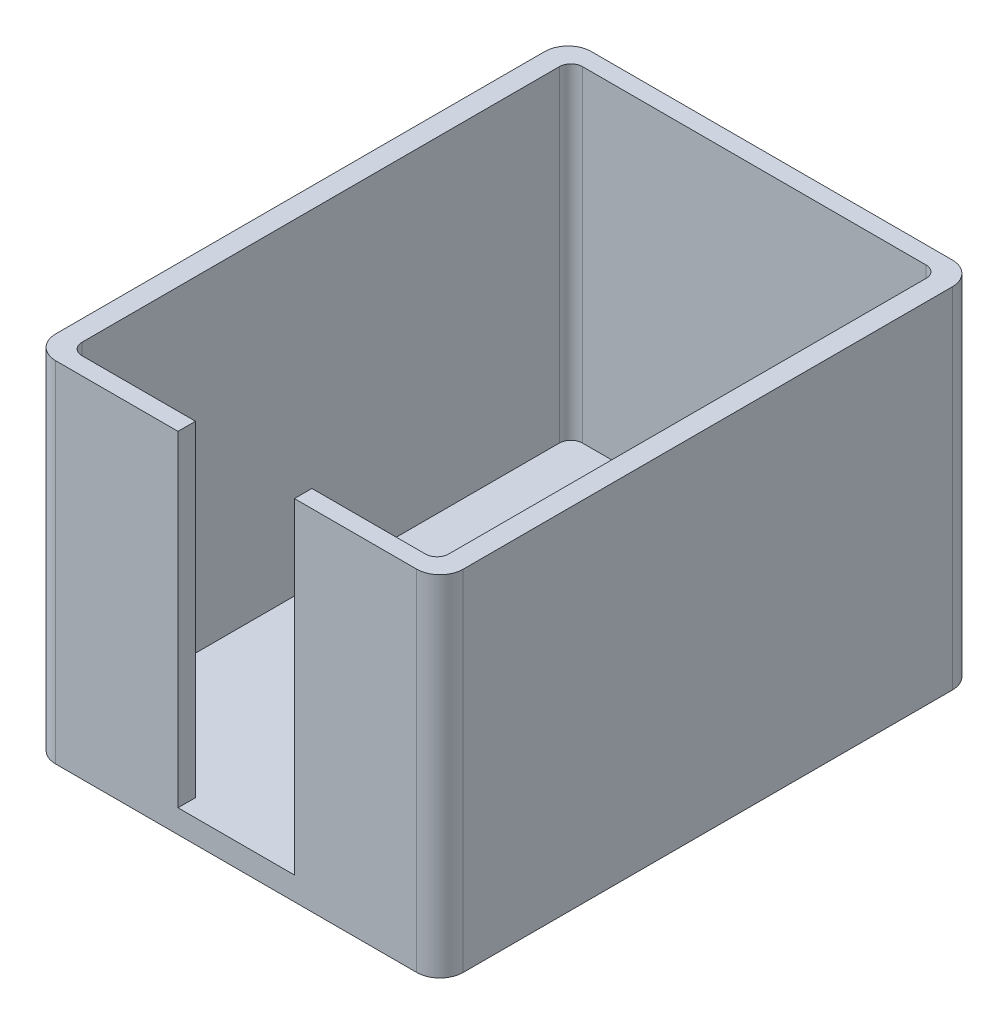
ISO-10303-21;
HEADER;
FILE_DESCRIPTION(('STEP AP214'),'2;1');
FILE_NAME('part.step','',(''),(''),'','','');
FILE_SCHEMA(('AUTOMOTIVE_DESIGN { 1 0 10303 214 1 1 1 1 }'));
ENDSEC;
DATA;
#1=APPLICATION_CONTEXT('core data for automotive mechanical design processes');
#2=APPLICATION_PROTOCOL_DEFINITION('international standard','automotive_design',2000,#1);
#3=PRODUCT_CONTEXT('',#1,'mechanical');
#4=PRODUCT('Part','Part','',(#3));
#5=PRODUCT_RELATED_PRODUCT_CATEGORY('part','',(#4));
#6=PRODUCT_DEFINITION_FORMATION('','',#4);
#7=PRODUCT_DEFINITION_CONTEXT('part definition',#1,'design');
#8=PRODUCT_DEFINITION('design','',#6,#7);
#9=PRODUCT_DEFINITION_SHAPE('','',#8);
#10=(LENGTH_UNIT() NAMED_UNIT(*) SI_UNIT(.MILLI.,.METRE.));
#11=(NAMED_UNIT(*) PLANE_ANGLE_UNIT() SI_UNIT($,.RADIAN.));
#12=(NAMED_UNIT(*) SI_UNIT($,.STERADIAN.) SOLID_ANGLE_UNIT());
#13=UNCERTAINTY_MEASURE_WITH_UNIT(LENGTH_MEASURE(1.E-05),#10,'distance_accuracy_value','');
#14=(GEOMETRIC_REPRESENTATION_CONTEXT(3) GLOBAL_UNCERTAINTY_ASSIGNED_CONTEXT((#13)) GLOBAL_UNIT_ASSIGNED_CONTEXT((#10,
#11,#12)) REPRESENTATION_CONTEXT('',''));
#15=CARTESIAN_POINT('',(0.,0.,0.));
#16=DIRECTION('',(0.,0.,1.));
#17=DIRECTION('',(1.,0.,0.));
#18=AXIS2_PLACEMENT_3D('',#15,#16,#17);
#19=CARTESIAN_POINT('',(-15.75,2.,21.5));
#20=DIRECTION('',(0.,0.,1.));
#21=DIRECTION('',(1.,0.,0.));
#22=AXIS2_PLACEMENT_3D('',#19,#20,#21);
#23=PLANE('',#22);
#24=DIRECTION('',(1.,0.,0.));
#25=VECTOR('',#24,1.);
#26=CARTESIAN_POINT('',(-15.75,2.,21.5));
#27=LINE('',#26,#25);
#28=CARTESIAN_POINT('',(5.,2.,21.5));
#29=VERTEX_POINT('',#28);
#30=CARTESIAN_POINT('',(14.75,2.,21.5));
#31=VERTEX_POINT('',#30);
#32=EDGE_CURVE('E292',#29,#31,#27,.T.);
#33=ORIENTED_EDGE('',*,*,#32,.F.);
#34=DIRECTION('',(0.,1.,0.));
#35=VECTOR('',#34,1.);
#36=CARTESIAN_POINT('',(5.,2.,21.5));
#37=LINE('',#36,#35);
#38=CARTESIAN_POINT('',(5.,30.,21.5));
#39=VERTEX_POINT('',#38);
#40=EDGE_CURVE('E293',#29,#39,#37,.T.);
#41=ORIENTED_EDGE('',*,*,#40,.T.);
#42=DIRECTION('',(1.,0.,0.));
#43=VECTOR('',#42,1.);
#44=CARTESIAN_POINT('',(-15.75,30.,21.5));
#45=LINE('',#44,#43);
#46=CARTESIAN_POINT('',(14.75,30.,21.5));
#47=VERTEX_POINT('',#46);
#48=EDGE_CURVE('E186',#39,#47,#45,.T.);
#49=ORIENTED_EDGE('',*,*,#48,.T.);
#50=DIRECTION('',(0.,1.,0.));
#51=VECTOR('',#50,1.);
#52=CARTESIAN_POINT('',(14.75,2.,21.5));
#53=LINE('',#52,#51);
#54=EDGE_CURVE('E270',#47,#31,#53,.F.);
#55=ORIENTED_EDGE('',*,*,#54,.T.);
#56=EDGE_LOOP('',(#33,#41,#49,#55));
#57=FACE_BOUND('',#56,.T.);
#58=ADVANCED_FACE('F33',(#57),#23,.F.);
#59=CARTESIAN_POINT('',(17.5,30.,-23.));
#60=DIRECTION('',(-1.,0.,0.));
#61=DIRECTION('',(0.,0.,1.));
#62=AXIS2_PLACEMENT_3D('',#59,#60,#61);
#63=PLANE('',#62);
#64=DIRECTION('',(0.,0.,-1.));
#65=VECTOR('',#64,1.);
#66=CARTESIAN_POINT('',(17.5,0.,-23.));
#67=LINE('',#66,#65);
#68=CARTESIAN_POINT('',(17.5,0.,21.));
#69=VERTEX_POINT('',#68);
#70=CARTESIAN_POINT('',(17.5,0.,-21.));
#71=VERTEX_POINT('',#70);
#72=EDGE_CURVE('E205',#69,#71,#67,.T.);
#73=ORIENTED_EDGE('',*,*,#72,.T.);
#74=DIRECTION('',(0.,-1.,0.));
#75=VECTOR('',#74,1.);
#76=CARTESIAN_POINT('',(17.5,30.,-21.));
#77=LINE('',#76,#75);
#78=CARTESIAN_POINT('',(17.5,30.,-21.));
#79=VERTEX_POINT('',#78);
#80=EDGE_CURVE('E246',#71,#79,#77,.F.);
#81=ORIENTED_EDGE('',*,*,#80,.T.);
#82=DIRECTION('',(0.,0.,-1.));
#83=VECTOR('',#82,1.);
#84=CARTESIAN_POINT('',(17.5,30.,-23.));
#85=LINE('',#84,#83);
#86=CARTESIAN_POINT('',(17.5,30.,21.));
#87=VERTEX_POINT('',#86);
#88=EDGE_CURVE('E217',#87,#79,#85,.T.);
#89=ORIENTED_EDGE('',*,*,#88,.F.);
#90=DIRECTION('',(0.,-1.,0.));
#91=VECTOR('',#90,1.);
#92=CARTESIAN_POINT('',(17.5,30.,21.));
#93=LINE('',#92,#91);
#94=EDGE_CURVE('E243',#87,#69,#93,.T.);
#95=ORIENTED_EDGE('',*,*,#94,.T.);
#96=EDGE_LOOP('',(#73,#81,#89,#95));
#97=FACE_BOUND('',#96,.T.);
#98=ADVANCED_FACE('F393',(#97),#63,.F.);
#99=CARTESIAN_POINT('',(-17.5,30.,-23.));
#100=DIRECTION('',(0.,0.,1.));
#101=DIRECTION('',(1.,0.,0.));
#102=AXIS2_PLACEMENT_3D('',#99,#100,#101);
#103=PLANE('',#102);
#104=DIRECTION('',(-1.,0.,0.));
#105=VECTOR('',#104,1.);
#106=CARTESIAN_POINT('',(-17.5,0.,-23.));
#107=LINE('',#106,#105);
#108=CARTESIAN_POINT('',(15.5,0.,-23.));
#109=VERTEX_POINT('',#108);
#110=CARTESIAN_POINT('',(-15.5,0.,-23.));
#111=VERTEX_POINT('',#110);
#112=EDGE_CURVE('E208',#109,#111,#107,.T.);
#113=ORIENTED_EDGE('',*,*,#112,.T.);
#114=DIRECTION('',(0.,-1.,0.));
#115=VECTOR('',#114,1.);
#116=CARTESIAN_POINT('',(-15.5,30.,-23.));
#117=LINE('',#116,#115);
#118=CARTESIAN_POINT('',(-15.5,30.,-23.));
#119=VERTEX_POINT('',#118);
#120=EDGE_CURVE('E233',#111,#119,#117,.F.);
#121=ORIENTED_EDGE('',*,*,#120,.T.);
#122=DIRECTION('',(-1.,0.,0.));
#123=VECTOR('',#122,1.);
#124=CARTESIAN_POINT('',(-17.5,30.,-23.));
#125=LINE('',#124,#123);
#126=CARTESIAN_POINT('',(15.5,30.,-23.));
#127=VERTEX_POINT('',#126);
#128=EDGE_CURVE('E201',#127,#119,#125,.T.);
#129=ORIENTED_EDGE('',*,*,#128,.F.);
#130=DIRECTION('',(0.,-1.,0.));
#131=VECTOR('',#130,1.);
#132=CARTESIAN_POINT('',(15.5,30.,-23.));
#133=LINE('',#132,#131);
#134=EDGE_CURVE('E230',#127,#109,#133,.T.);
#135=ORIENTED_EDGE('',*,*,#134,.T.);
#136=EDGE_LOOP('',(#113,#121,#129,#135));
#137=FACE_BOUND('',#136,.T.);
#138=ADVANCED_FACE('F397',(#137),#103,.F.);
#139=CARTESIAN_POINT('',(-17.5,30.,-23.));
#140=DIRECTION('',(1.,0.,0.));
#141=DIRECTION('',(0.,0.,-1.));
#142=AXIS2_PLACEMENT_3D('',#139,#140,#141);
#143=PLANE('',#142);
#144=DIRECTION('',(0.,0.,1.));
#145=VECTOR('',#144,1.);
#146=CARTESIAN_POINT('',(-17.5,30.,-23.));
#147=LINE('',#146,#145);
#148=CARTESIAN_POINT('',(-17.5,30.,-21.));
#149=VERTEX_POINT('',#148);
#150=CARTESIAN_POINT('',(-17.5,30.,21.));
#151=VERTEX_POINT('',#150);
#152=EDGE_CURVE('E196',#149,#151,#147,.T.);
#153=ORIENTED_EDGE('',*,*,#152,.F.);
#154=DIRECTION('',(0.,-1.,0.));
#155=VECTOR('',#154,1.);
#156=CARTESIAN_POINT('',(-17.5,30.,-21.));
#157=LINE('',#156,#155);
#158=CARTESIAN_POINT('',(-17.5,0.,-21.));
#159=VERTEX_POINT('',#158);
#160=EDGE_CURVE('E219',#149,#159,#157,.T.);
#161=ORIENTED_EDGE('',*,*,#160,.T.);
#162=DIRECTION('',(0.,0.,1.));
#163=VECTOR('',#162,1.);
#164=CARTESIAN_POINT('',(-17.5,0.,-23.));
#165=LINE('',#164,#163);
#166=CARTESIAN_POINT('',(-17.5,0.,21.));
#167=VERTEX_POINT('',#166);
#168=EDGE_CURVE('E212',#159,#167,#165,.T.);
#169=ORIENTED_EDGE('',*,*,#168,.T.);
#170=DIRECTION('',(0.,-1.,0.));
#171=VECTOR('',#170,1.);
#172=CARTESIAN_POINT('',(-17.5,30.,21.));
#173=LINE('',#172,#171);
#174=EDGE_CURVE('E199',#167,#151,#173,.F.);
#175=ORIENTED_EDGE('',*,*,#174,.T.);
#176=EDGE_LOOP('',(#153,#161,#169,#175));
#177=FACE_BOUND('',#176,.T.);
#178=ADVANCED_FACE('F318',(#177),#143,.F.);
#179=CARTESIAN_POINT('',(-17.5,30.,23.));
#180=DIRECTION('',(0.,0.,-1.));
#181=DIRECTION('',(-1.,0.,0.));
#182=AXIS2_PLACEMENT_3D('',#179,#180,#181);
#183=PLANE('',#182);
#184=DIRECTION('',(1.,0.,0.));
#185=VECTOR('',#184,1.);
#186=CARTESIAN_POINT('',(-17.5,30.,23.));
#187=LINE('',#186,#185);
#188=CARTESIAN_POINT('',(5.,30.,23.));
#189=VERTEX_POINT('',#188);
#190=CARTESIAN_POINT('',(15.5,30.,23.));
#191=VERTEX_POINT('',#190);
#192=EDGE_CURVE('E183',#189,#191,#187,.T.);
#193=ORIENTED_EDGE('',*,*,#192,.F.);
#194=DIRECTION('',(0.,1.,0.));
#195=VECTOR('',#194,1.);
#196=CARTESIAN_POINT('',(5.,30.,23.));
#197=LINE('',#196,#195);
#198=CARTESIAN_POINT('',(5.,2.,23.));
#199=VERTEX_POINT('',#198);
#200=EDGE_CURVE('E168',#199,#189,#197,.T.);
#201=ORIENTED_EDGE('',*,*,#200,.F.);
#202=DIRECTION('',(1.,0.,0.));
#203=VECTOR('',#202,1.);
#204=CARTESIAN_POINT('',(5.,2.,23.));
#205=LINE('',#204,#203);
#206=CARTESIAN_POINT('',(-5.,2.,23.));
#207=VERTEX_POINT('',#206);
#208=EDGE_CURVE('E188',#207,#199,#205,.T.);
#209=ORIENTED_EDGE('',*,*,#208,.F.);
#210=DIRECTION('',(0.,-1.,0.));
#211=VECTOR('',#210,1.);
#212=CARTESIAN_POINT('',(-5.,30.,23.));
#213=LINE('',#212,#211);
#214=CARTESIAN_POINT('',(-5.,30.,23.));
#215=VERTEX_POINT('',#214);
#216=EDGE_CURVE('E179',#215,#207,#213,.T.);
#217=ORIENTED_EDGE('',*,*,#216,.F.);
#218=CARTESIAN_POINT('',(-15.5,30.,23.));
#219=VERTEX_POINT('',#218);
#220=EDGE_CURVE('E195',#219,#215,#187,.T.);
#221=ORIENTED_EDGE('',*,*,#220,.F.);
#222=DIRECTION('',(0.,-1.,0.));
#223=VECTOR('',#222,1.);
#224=CARTESIAN_POINT('',(-15.5,30.,23.));
#225=LINE('',#224,#223);
#226=CARTESIAN_POINT('',(-15.5,0.,23.));
#227=VERTEX_POINT('',#226);
#228=EDGE_CURVE('E248',#219,#227,#225,.T.);
#229=ORIENTED_EDGE('',*,*,#228,.T.);
#230=DIRECTION('',(1.,0.,0.));
#231=VECTOR('',#230,1.);
#232=CARTESIAN_POINT('',(-17.5,0.,23.));
#233=LINE('',#232,#231);
#234=CARTESIAN_POINT('',(15.5,0.,23.));
#235=VERTEX_POINT('',#234);
#236=EDGE_CURVE('E215',#227,#235,#233,.T.);
#237=ORIENTED_EDGE('',*,*,#236,.T.);
#238=DIRECTION('',(0.,-1.,0.));
#239=VECTOR('',#238,1.);
#240=CARTESIAN_POINT('',(15.5,30.,23.));
#241=LINE('',#240,#239);
#242=EDGE_CURVE('E193',#235,#191,#241,.F.);
#243=ORIENTED_EDGE('',*,*,#242,.T.);
#244=EDGE_LOOP('',(#193,#201,#209,#217,#221,#229,#237,#243));
#245=FACE_BOUND('',#244,.T.);
#246=ADVANCED_FACE('F190',(#245),#183,.F.);
#247=CARTESIAN_POINT('',(0.,30.,0.));
#248=DIRECTION('',(0.,1.,0.));
#249=DIRECTION('',(0.,0.,1.));
#250=AXIS2_PLACEMENT_3D('',#247,#248,#249);
#251=PLANE('',#250);
#252=DIRECTION('',(0.,0.,1.));
#253=VECTOR('',#252,1.);
#254=CARTESIAN_POINT('',(5.,30.,15.));
#255=LINE('',#254,#253);
#256=EDGE_CURVE('E171',#39,#189,#255,.T.);
#257=ORIENTED_EDGE('',*,*,#256,.T.);
#258=ORIENTED_EDGE('',*,*,#192,.T.);
#259=CARTESIAN_POINT('',(15.5,30.,21.));
#260=DIRECTION('',(0.,1.,0.));
#261=DIRECTION('',(0.,0.,1.));
#262=AXIS2_PLACEMENT_3D('',#259,#260,#261);
#263=CIRCLE('',#262,2.);
#264=EDGE_CURVE('E237',#191,#87,#263,.T.);
#265=ORIENTED_EDGE('',*,*,#264,.T.);
#266=ORIENTED_EDGE('',*,*,#88,.T.);
#267=CARTESIAN_POINT('',(15.5,30.,-21.));
#268=DIRECTION('',(0.,1.,0.));
#269=DIRECTION('',(0.,0.,1.));
#270=AXIS2_PLACEMENT_3D('',#267,#268,#269);
#271=CIRCLE('',#270,2.);
#272=EDGE_CURVE('E239',#79,#127,#271,.T.);
#273=ORIENTED_EDGE('',*,*,#272,.T.);
#274=ORIENTED_EDGE('',*,*,#128,.T.);
#275=CARTESIAN_POINT('',(-15.5,30.,-21.));
#276=DIRECTION('',(0.,1.,0.));
#277=DIRECTION('',(0.,0.,1.));
#278=AXIS2_PLACEMENT_3D('',#275,#276,#277);
#279=CIRCLE('',#278,2.);
#280=EDGE_CURVE('E241',#119,#149,#279,.T.);
#281=ORIENTED_EDGE('',*,*,#280,.T.);
#282=ORIENTED_EDGE('',*,*,#152,.T.);
#283=CARTESIAN_POINT('',(-15.5,30.,21.));
#284=DIRECTION('',(0.,1.,0.));
#285=DIRECTION('',(0.,0.,1.));
#286=AXIS2_PLACEMENT_3D('',#283,#284,#285);
#287=CIRCLE('',#286,2.);
#288=EDGE_CURVE('E235',#151,#219,#287,.T.);
#289=ORIENTED_EDGE('',*,*,#288,.T.);
#290=ORIENTED_EDGE('',*,*,#220,.T.);
#291=DIRECTION('',(0.,0.,1.));
#292=VECTOR('',#291,1.);
#293=CARTESIAN_POINT('',(-5.,30.,15.));
#294=LINE('',#293,#292);
#295=CARTESIAN_POINT('',(-5.,30.,21.5));
#296=VERTEX_POINT('',#295);
#297=EDGE_CURVE('E187',#296,#215,#294,.T.);
#298=ORIENTED_EDGE('',*,*,#297,.F.);
#299=CARTESIAN_POINT('',(-14.75,30.,21.5));
#300=VERTEX_POINT('',#299);
#301=EDGE_CURVE('E294',#300,#296,#45,.T.);
#302=ORIENTED_EDGE('',*,*,#301,.F.);
#303=CARTESIAN_POINT('',(-14.75,30.,20.5));
#304=DIRECTION('',(0.,1.,0.));
#305=DIRECTION('',(0.,0.,1.));
#306=AXIS2_PLACEMENT_3D('',#303,#304,#305);
#307=CIRCLE('',#306,1.);
#308=CARTESIAN_POINT('',(-15.75,30.,20.5));
#309=VERTEX_POINT('',#308);
#310=EDGE_CURVE('E283',#300,#309,#307,.F.);
#311=ORIENTED_EDGE('',*,*,#310,.T.);
#312=DIRECTION('',(0.,0.,1.));
#313=VECTOR('',#312,1.);
#314=CARTESIAN_POINT('',(-15.75,30.,-21.5));
#315=LINE('',#314,#313);
#316=CARTESIAN_POINT('',(-15.75,30.,-20.5));
#317=VERTEX_POINT('',#316);
#318=EDGE_CURVE('E295',#317,#309,#315,.T.);
#319=ORIENTED_EDGE('',*,*,#318,.F.);
#320=CARTESIAN_POINT('',(-14.75,30.,-20.5));
#321=DIRECTION('',(0.,1.,0.));
#322=DIRECTION('',(0.,0.,1.));
#323=AXIS2_PLACEMENT_3D('',#320,#321,#322);
#324=CIRCLE('',#323,1.);
#325=CARTESIAN_POINT('',(-14.75,30.,-21.5));
#326=VERTEX_POINT('',#325);
#327=EDGE_CURVE('E281',#317,#326,#324,.F.);
#328=ORIENTED_EDGE('',*,*,#327,.T.);
#329=DIRECTION('',(-1.,0.,0.));
#330=VECTOR('',#329,1.);
#331=CARTESIAN_POINT('',(-15.75,30.,-21.5));
#332=LINE('',#331,#330);
#333=CARTESIAN_POINT('',(14.75,30.,-21.5));
#334=VERTEX_POINT('',#333);
#335=EDGE_CURVE('E300',#334,#326,#332,.T.);
#336=ORIENTED_EDGE('',*,*,#335,.F.);
#337=CARTESIAN_POINT('',(14.75,30.,-20.5));
#338=DIRECTION('',(0.,1.,0.));
#339=DIRECTION('',(0.,0.,1.));
#340=AXIS2_PLACEMENT_3D('',#337,#338,#339);
#341=CIRCLE('',#340,1.);
#342=CARTESIAN_POINT('',(15.75,30.,-20.5));
#343=VERTEX_POINT('',#342);
#344=EDGE_CURVE('E11',#334,#343,#341,.F.);
#345=ORIENTED_EDGE('',*,*,#344,.T.);
#346=DIRECTION('',(0.,0.,-1.));
#347=VECTOR('',#346,1.);
#348=CARTESIAN_POINT('',(15.75,30.,-21.5));
#349=LINE('',#348,#347);
#350=CARTESIAN_POINT('',(15.75,30.,20.5));
#351=VERTEX_POINT('',#350);
#352=EDGE_CURVE('E285',#351,#343,#349,.T.);
#353=ORIENTED_EDGE('',*,*,#352,.F.);
#354=CARTESIAN_POINT('',(14.75,30.,20.5));
#355=DIRECTION('',(0.,1.,0.));
#356=DIRECTION('',(0.,0.,1.));
#357=AXIS2_PLACEMENT_3D('',#354,#355,#356);
#358=CIRCLE('',#357,1.);
#359=EDGE_CURVE('E41',#351,#47,#358,.F.);
#360=ORIENTED_EDGE('',*,*,#359,.T.);
#361=ORIENTED_EDGE('',*,*,#48,.F.);
#362=EDGE_LOOP('',(#257,#258,#265,#266,#273,#274,#281,#282,#289,#290,#298,#302,#311,#319,#328,
#336,#345,#353,#360,#361));
#363=FACE_BOUND('',#362,.T.);
#364=ADVANCED_FACE('F182',(#363),#251,.T.);
#365=CARTESIAN_POINT('',(0.,0.,0.));
#366=DIRECTION('',(0.,1.,0.));
#367=DIRECTION('',(0.,0.,1.));
#368=AXIS2_PLACEMENT_3D('',#365,#366,#367);
#369=PLANE('',#368);
#370=ORIENTED_EDGE('',*,*,#168,.F.);
#371=CARTESIAN_POINT('',(-15.5,0.,-21.));
#372=DIRECTION('',(0.,1.,0.));
#373=DIRECTION('',(0.,0.,1.));
#374=AXIS2_PLACEMENT_3D('',#371,#372,#373);
#375=CIRCLE('',#374,2.);
#376=EDGE_CURVE('E228',#159,#111,#375,.F.);
#377=ORIENTED_EDGE('',*,*,#376,.T.);
#378=ORIENTED_EDGE('',*,*,#112,.F.);
#379=CARTESIAN_POINT('',(15.5,0.,-21.));
#380=DIRECTION('',(0.,1.,0.));
#381=DIRECTION('',(0.,0.,1.));
#382=AXIS2_PLACEMENT_3D('',#379,#380,#381);
#383=CIRCLE('',#382,2.);
#384=EDGE_CURVE('E226',#109,#71,#383,.F.);
#385=ORIENTED_EDGE('',*,*,#384,.T.);
#386=ORIENTED_EDGE('',*,*,#72,.F.);
#387=CARTESIAN_POINT('',(15.5,0.,21.));
#388=DIRECTION('',(0.,1.,0.));
#389=DIRECTION('',(0.,0.,1.));
#390=AXIS2_PLACEMENT_3D('',#387,#388,#389);
#391=CIRCLE('',#390,2.);
#392=EDGE_CURVE('E224',#69,#235,#391,.F.);
#393=ORIENTED_EDGE('',*,*,#392,.T.);
#394=ORIENTED_EDGE('',*,*,#236,.F.);
#395=CARTESIAN_POINT('',(-15.5,0.,21.));
#396=DIRECTION('',(0.,1.,0.));
#397=DIRECTION('',(0.,0.,1.));
#398=AXIS2_PLACEMENT_3D('',#395,#396,#397);
#399=CIRCLE('',#398,2.);
#400=EDGE_CURVE('E222',#227,#167,#399,.F.);
#401=ORIENTED_EDGE('',*,*,#400,.T.);
#402=EDGE_LOOP('',(#370,#377,#378,#385,#386,#393,#394,#401));
#403=FACE_BOUND('',#402,.T.);
#404=ADVANCED_FACE('F321',(#403),#369,.F.);
#405=CARTESIAN_POINT('',(15.75,2.,-21.5));
#406=DIRECTION('',(1.,0.,0.));
#407=DIRECTION('',(0.,0.,-1.));
#408=AXIS2_PLACEMENT_3D('',#405,#406,#407);
#409=PLANE('',#408);
#410=DIRECTION('',(0.,0.,-1.));
#411=VECTOR('',#410,1.);
#412=CARTESIAN_POINT('',(15.75,2.,-21.5));
#413=LINE('',#412,#411);
#414=CARTESIAN_POINT('',(15.75,2.,20.5));
#415=VERTEX_POINT('',#414);
#416=CARTESIAN_POINT('',(15.75,2.,-20.5));
#417=VERTEX_POINT('',#416);
#418=EDGE_CURVE('E298',#415,#417,#413,.T.);
#419=ORIENTED_EDGE('',*,*,#418,.F.);
#420=DIRECTION('',(0.,1.,0.));
#421=VECTOR('',#420,1.);
#422=CARTESIAN_POINT('',(15.75,30.,20.5));
#423=LINE('',#422,#421);
#424=EDGE_CURVE('E278',#415,#351,#423,.T.);
#425=ORIENTED_EDGE('',*,*,#424,.T.);
#426=ORIENTED_EDGE('',*,*,#352,.T.);
#427=DIRECTION('',(0.,1.,0.));
#428=VECTOR('',#427,1.);
#429=CARTESIAN_POINT('',(15.75,2.,-20.5));
#430=LINE('',#429,#428);
#431=EDGE_CURVE('E276',#343,#417,#430,.F.);
#432=ORIENTED_EDGE('',*,*,#431,.T.);
#433=EDGE_LOOP('',(#419,#425,#426,#432));
#434=FACE_BOUND('',#433,.T.);
#435=ADVANCED_FACE('F381',(#434),#409,.F.);
#436=ORIENTED_EDGE('',*,*,#301,.T.);
#437=DIRECTION('',(0.,-1.,0.));
#438=VECTOR('',#437,1.);
#439=CARTESIAN_POINT('',(-5.,2.,21.5));
#440=LINE('',#439,#438);
#441=CARTESIAN_POINT('',(-5.,2.,21.5));
#442=VERTEX_POINT('',#441);
#443=EDGE_CURVE('E336',#296,#442,#440,.T.);
#444=ORIENTED_EDGE('',*,*,#443,.T.);
#445=CARTESIAN_POINT('',(-14.75,2.,21.5));
#446=VERTEX_POINT('',#445);
#447=EDGE_CURVE('E209',#446,#442,#27,.T.);
#448=ORIENTED_EDGE('',*,*,#447,.F.);
#449=DIRECTION('',(0.,1.,0.));
#450=VECTOR('',#449,1.);
#451=CARTESIAN_POINT('',(-14.75,30.,21.5));
#452=LINE('',#451,#450);
#453=EDGE_CURVE('E273',#446,#300,#452,.T.);
#454=ORIENTED_EDGE('',*,*,#453,.T.);
#455=EDGE_LOOP('',(#436,#444,#448,#454));
#456=FACE_BOUND('',#455,.T.);
#457=ADVANCED_FACE('F334',(#456),#23,.F.);
#458=CARTESIAN_POINT('',(-15.75,2.,-21.5));
#459=DIRECTION('',(-1.,0.,0.));
#460=DIRECTION('',(0.,0.,1.));
#461=AXIS2_PLACEMENT_3D('',#458,#459,#460);
#462=PLANE('',#461);
#463=DIRECTION('',(0.,0.,1.));
#464=VECTOR('',#463,1.);
#465=CARTESIAN_POINT('',(-15.75,2.,-21.5));
#466=LINE('',#465,#464);
#467=CARTESIAN_POINT('',(-15.75,2.,-20.5));
#468=VERTEX_POINT('',#467);
#469=CARTESIAN_POINT('',(-15.75,2.,20.5));
#470=VERTEX_POINT('',#469);
#471=EDGE_CURVE('E349',#468,#470,#466,.T.);
#472=ORIENTED_EDGE('',*,*,#471,.F.);
#473=DIRECTION('',(0.,1.,0.));
#474=VECTOR('',#473,1.);
#475=CARTESIAN_POINT('',(-15.75,30.,-20.5));
#476=LINE('',#475,#474);
#477=EDGE_CURVE('E254',#468,#317,#476,.T.);
#478=ORIENTED_EDGE('',*,*,#477,.T.);
#479=ORIENTED_EDGE('',*,*,#318,.T.);
#480=DIRECTION('',(0.,1.,0.));
#481=VECTOR('',#480,1.);
#482=CARTESIAN_POINT('',(-15.75,2.,20.5));
#483=LINE('',#482,#481);
#484=EDGE_CURVE('E252',#309,#470,#483,.F.);
#485=ORIENTED_EDGE('',*,*,#484,.T.);
#486=EDGE_LOOP('',(#472,#478,#479,#485));
#487=FACE_BOUND('',#486,.T.);
#488=ADVANCED_FACE('F346',(#487),#462,.F.);
#489=CARTESIAN_POINT('',(-15.75,2.,-21.5));
#490=DIRECTION('',(0.,0.,-1.));
#491=DIRECTION('',(-1.,0.,0.));
#492=AXIS2_PLACEMENT_3D('',#489,#490,#491);
#493=PLANE('',#492);
#494=ORIENTED_EDGE('',*,*,#335,.T.);
#495=DIRECTION('',(0.,1.,0.));
#496=VECTOR('',#495,1.);
#497=CARTESIAN_POINT('',(-14.75,2.,-21.5));
#498=LINE('',#497,#496);
#499=CARTESIAN_POINT('',(-14.75,2.,-21.5));
#500=VERTEX_POINT('',#499);
#501=EDGE_CURVE('E260',#326,#500,#498,.F.);
#502=ORIENTED_EDGE('',*,*,#501,.T.);
#503=DIRECTION('',(-1.,0.,0.));
#504=VECTOR('',#503,1.);
#505=CARTESIAN_POINT('',(-15.75,2.,-21.5));
#506=LINE('',#505,#504);
#507=CARTESIAN_POINT('',(14.75,2.,-21.5));
#508=VERTEX_POINT('',#507);
#509=EDGE_CURVE('E364',#508,#500,#506,.T.);
#510=ORIENTED_EDGE('',*,*,#509,.F.);
#511=DIRECTION('',(0.,1.,0.));
#512=VECTOR('',#511,1.);
#513=CARTESIAN_POINT('',(14.75,30.,-21.5));
#514=LINE('',#513,#512);
#515=EDGE_CURVE('E257',#508,#334,#514,.T.);
#516=ORIENTED_EDGE('',*,*,#515,.T.);
#517=EDGE_LOOP('',(#494,#502,#510,#516));
#518=FACE_BOUND('',#517,.T.);
#519=ADVANCED_FACE('F356',(#518),#493,.F.);
#520=CARTESIAN_POINT('',(0.,2.,0.));
#521=DIRECTION('',(0.,1.,0.));
#522=DIRECTION('',(0.,0.,1.));
#523=AXIS2_PLACEMENT_3D('',#520,#521,#522);
#524=PLANE('',#523);
#525=ORIENTED_EDGE('',*,*,#447,.T.);
#526=DIRECTION('',(0.,0.,1.));
#527=VECTOR('',#526,1.);
#528=CARTESIAN_POINT('',(-5.,2.,15.));
#529=LINE('',#528,#527);
#530=EDGE_CURVE('E48',#442,#207,#529,.T.);
#531=ORIENTED_EDGE('',*,*,#530,.T.);
#532=ORIENTED_EDGE('',*,*,#208,.T.);
#533=DIRECTION('',(0.,0.,1.));
#534=VECTOR('',#533,1.);
#535=CARTESIAN_POINT('',(5.,2.,15.));
#536=LINE('',#535,#534);
#537=EDGE_CURVE('E174',#29,#199,#536,.T.);
#538=ORIENTED_EDGE('',*,*,#537,.F.);
#539=ORIENTED_EDGE('',*,*,#32,.T.);
#540=CARTESIAN_POINT('',(14.75,2.,20.5));
#541=DIRECTION('',(0.,1.,0.));
#542=DIRECTION('',(0.,0.,1.));
#543=AXIS2_PLACEMENT_3D('',#540,#541,#542);
#544=CIRCLE('',#543,1.);
#545=EDGE_CURVE('E264',#31,#415,#544,.T.);
#546=ORIENTED_EDGE('',*,*,#545,.T.);
#547=ORIENTED_EDGE('',*,*,#418,.T.);
#548=CARTESIAN_POINT('',(14.75,2.,-20.5));
#549=DIRECTION('',(0.,1.,0.));
#550=DIRECTION('',(0.,0.,1.));
#551=AXIS2_PLACEMENT_3D('',#548,#549,#550);
#552=CIRCLE('',#551,1.);
#553=EDGE_CURVE('E262',#417,#508,#552,.T.);
#554=ORIENTED_EDGE('',*,*,#553,.T.);
#555=ORIENTED_EDGE('',*,*,#509,.T.);
#556=CARTESIAN_POINT('',(-14.75,2.,-20.5));
#557=DIRECTION('',(0.,1.,0.));
#558=DIRECTION('',(0.,0.,1.));
#559=AXIS2_PLACEMENT_3D('',#556,#557,#558);
#560=CIRCLE('',#559,1.);
#561=EDGE_CURVE('E268',#500,#468,#560,.T.);
#562=ORIENTED_EDGE('',*,*,#561,.T.);
#563=ORIENTED_EDGE('',*,*,#471,.T.);
#564=CARTESIAN_POINT('',(-14.75,2.,20.5));
#565=DIRECTION('',(0.,1.,0.));
#566=DIRECTION('',(0.,0.,1.));
#567=AXIS2_PLACEMENT_3D('',#564,#565,#566);
#568=CIRCLE('',#567,1.);
#569=EDGE_CURVE('E266',#470,#446,#568,.T.);
#570=ORIENTED_EDGE('',*,*,#569,.T.);
#571=EDGE_LOOP('',(#525,#531,#532,#538,#539,#546,#547,#554,#555,#562,#563,#570));
#572=FACE_BOUND('',#571,.T.);
#573=ADVANCED_FACE('F375',(#572),#524,.T.);
#574=CARTESIAN_POINT('',(-15.5,30.,-21.));
#575=DIRECTION('',(0.,-1.,0.));
#576=DIRECTION('',(0.,0.,-1.));
#577=AXIS2_PLACEMENT_3D('',#574,#575,#576);
#578=CYLINDRICAL_SURFACE('',#577,2.);
#579=ORIENTED_EDGE('',*,*,#280,.F.);
#580=ORIENTED_EDGE('',*,*,#120,.F.);
#581=ORIENTED_EDGE('',*,*,#376,.F.);
#582=ORIENTED_EDGE('',*,*,#160,.F.);
#583=EDGE_LOOP('',(#579,#580,#581,#582));
#584=FACE_BOUND('',#583,.T.);
#585=ADVANCED_FACE('F315',(#584),#578,.T.);
#586=CARTESIAN_POINT('',(15.5,30.,-21.));
#587=DIRECTION('',(0.,-1.,0.));
#588=DIRECTION('',(0.,0.,-1.));
#589=AXIS2_PLACEMENT_3D('',#586,#587,#588);
#590=CYLINDRICAL_SURFACE('',#589,2.);
#591=ORIENTED_EDGE('',*,*,#272,.F.);
#592=ORIENTED_EDGE('',*,*,#80,.F.);
#593=ORIENTED_EDGE('',*,*,#384,.F.);
#594=ORIENTED_EDGE('',*,*,#134,.F.);
#595=EDGE_LOOP('',(#591,#592,#593,#594));
#596=FACE_BOUND('',#595,.T.);
#597=ADVANCED_FACE('F411',(#596),#590,.T.);
#598=CARTESIAN_POINT('',(15.5,30.,21.));
#599=DIRECTION('',(0.,-1.,0.));
#600=DIRECTION('',(0.,0.,-1.));
#601=AXIS2_PLACEMENT_3D('',#598,#599,#600);
#602=CYLINDRICAL_SURFACE('',#601,2.);
#603=ORIENTED_EDGE('',*,*,#264,.F.);
#604=ORIENTED_EDGE('',*,*,#242,.F.);
#605=ORIENTED_EDGE('',*,*,#392,.F.);
#606=ORIENTED_EDGE('',*,*,#94,.F.);
#607=EDGE_LOOP('',(#603,#604,#605,#606));
#608=FACE_BOUND('',#607,.T.);
#609=ADVANCED_FACE('F416',(#608),#602,.T.);
#610=CARTESIAN_POINT('',(-15.5,30.,21.));
#611=DIRECTION('',(0.,-1.,0.));
#612=DIRECTION('',(0.,0.,-1.));
#613=AXIS2_PLACEMENT_3D('',#610,#611,#612);
#614=CYLINDRICAL_SURFACE('',#613,2.);
#615=ORIENTED_EDGE('',*,*,#288,.F.);
#616=ORIENTED_EDGE('',*,*,#174,.F.);
#617=ORIENTED_EDGE('',*,*,#400,.F.);
#618=ORIENTED_EDGE('',*,*,#228,.F.);
#619=EDGE_LOOP('',(#615,#616,#617,#618));
#620=FACE_BOUND('',#619,.T.);
#621=ADVANCED_FACE('F327',(#620),#614,.T.);
#622=CARTESIAN_POINT('',(-14.75,2.,-20.5));
#623=DIRECTION('',(0.,-1.,0.));
#624=DIRECTION('',(0.,0.,-1.));
#625=AXIS2_PLACEMENT_3D('',#622,#623,#624);
#626=CYLINDRICAL_SURFACE('',#625,1.);
#627=ORIENTED_EDGE('',*,*,#561,.F.);
#628=ORIENTED_EDGE('',*,*,#501,.F.);
#629=ORIENTED_EDGE('',*,*,#327,.F.);
#630=ORIENTED_EDGE('',*,*,#477,.F.);
#631=EDGE_LOOP('',(#627,#628,#629,#630));
#632=FACE_BOUND('',#631,.T.);
#633=ADVANCED_FACE('F352',(#632),#626,.F.);
#634=CARTESIAN_POINT('',(-14.75,2.,20.5));
#635=DIRECTION('',(0.,-1.,0.));
#636=DIRECTION('',(0.,0.,-1.));
#637=AXIS2_PLACEMENT_3D('',#634,#635,#636);
#638=CYLINDRICAL_SURFACE('',#637,1.);
#639=ORIENTED_EDGE('',*,*,#569,.F.);
#640=ORIENTED_EDGE('',*,*,#484,.F.);
#641=ORIENTED_EDGE('',*,*,#310,.F.);
#642=ORIENTED_EDGE('',*,*,#453,.F.);
#643=EDGE_LOOP('',(#639,#640,#641,#642));
#644=FACE_BOUND('',#643,.T.);
#645=ADVANCED_FACE('F341',(#644),#638,.F.);
#646=CARTESIAN_POINT('',(14.75,2.,20.5));
#647=DIRECTION('',(0.,-1.,0.));
#648=DIRECTION('',(0.,0.,-1.));
#649=AXIS2_PLACEMENT_3D('',#646,#647,#648);
#650=CYLINDRICAL_SURFACE('',#649,1.);
#651=ORIENTED_EDGE('',*,*,#545,.F.);
#652=ORIENTED_EDGE('',*,*,#54,.F.);
#653=ORIENTED_EDGE('',*,*,#359,.F.);
#654=ORIENTED_EDGE('',*,*,#424,.F.);
#655=EDGE_LOOP('',(#651,#652,#653,#654));
#656=FACE_BOUND('',#655,.T.);
#657=ADVANCED_FACE('F289',(#656),#650,.F.);
#658=CARTESIAN_POINT('',(14.75,2.,-20.5));
#659=DIRECTION('',(0.,-1.,0.));
#660=DIRECTION('',(0.,0.,-1.));
#661=AXIS2_PLACEMENT_3D('',#658,#659,#660);
#662=CYLINDRICAL_SURFACE('',#661,1.);
#663=ORIENTED_EDGE('',*,*,#553,.F.);
#664=ORIENTED_EDGE('',*,*,#431,.F.);
#665=ORIENTED_EDGE('',*,*,#344,.F.);
#666=ORIENTED_EDGE('',*,*,#515,.F.);
#667=EDGE_LOOP('',(#663,#664,#665,#666));
#668=FACE_BOUND('',#667,.T.);
#669=ADVANCED_FACE('F35',(#668),#662,.F.);
#670=CARTESIAN_POINT('',(5.,30.,15.));
#671=DIRECTION('',(1.,0.,0.));
#672=DIRECTION('',(0.,1.,0.));
#673=AXIS2_PLACEMENT_3D('',#670,#671,#672);
#674=PLANE('',#673);
#675=ORIENTED_EDGE('',*,*,#537,.T.);
#676=ORIENTED_EDGE('',*,*,#200,.T.);
#677=ORIENTED_EDGE('',*,*,#256,.F.);
#678=ORIENTED_EDGE('',*,*,#40,.F.);
#679=EDGE_LOOP('',(#675,#676,#677,#678));
#680=FACE_BOUND('',#679,.T.);
#681=ADVANCED_FACE('F170',(#680),#674,.F.);
#682=CARTESIAN_POINT('',(-5.,30.,15.));
#683=DIRECTION('',(-1.,0.,0.));
#684=DIRECTION('',(0.,-1.,0.));
#685=AXIS2_PLACEMENT_3D('',#682,#683,#684);
#686=PLANE('',#685);
#687=ORIENTED_EDGE('',*,*,#297,.T.);
#688=ORIENTED_EDGE('',*,*,#216,.T.);
#689=ORIENTED_EDGE('',*,*,#530,.F.);
#690=ORIENTED_EDGE('',*,*,#443,.F.);
#691=EDGE_LOOP('',(#687,#688,#689,#690));
#692=FACE_BOUND('',#691,.T.);
#693=ADVANCED_FACE('F373',(#692),#686,.F.);
#694=CLOSED_SHELL('',(#58,#98,#138,#178,#246,#364,#404,#435,#457,#488,#519,#573,#585,#597,#609,
#621,#633,#645,#657,#669,#681,#693));
#695=MANIFOLD_SOLID_BREP('B2',#694);
#696=ADVANCED_BREP_SHAPE_REPRESENTATION('',(#18,#695),#14);
#697=SHAPE_DEFINITION_REPRESENTATION(#9,#696);
ENDSEC;
END-ISO-10303-21;
